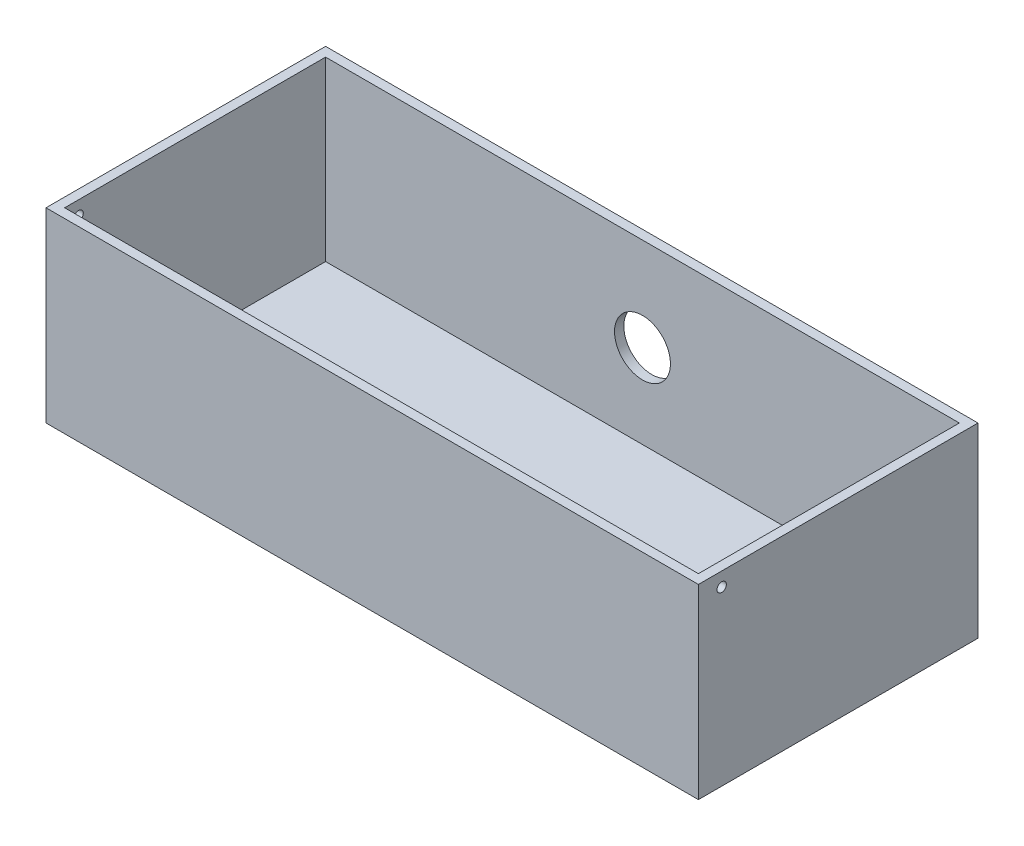
ISO-10303-21;
HEADER;
FILE_DESCRIPTION(('STEP AP214'),'2;1');
FILE_NAME('part.step','',(''),(''),'','','');
FILE_SCHEMA(('AUTOMOTIVE_DESIGN { 1 0 10303 214 1 1 1 1 }'));
ENDSEC;
DATA;
#1=APPLICATION_CONTEXT('core data for automotive mechanical design processes');
#2=APPLICATION_PROTOCOL_DEFINITION('international standard','automotive_design',2000,#1);
#3=PRODUCT_CONTEXT('',#1,'mechanical');
#4=PRODUCT('Part','Part','',(#3));
#5=PRODUCT_RELATED_PRODUCT_CATEGORY('part','',(#4));
#6=PRODUCT_DEFINITION_FORMATION('','',#4);
#7=PRODUCT_DEFINITION_CONTEXT('part definition',#1,'design');
#8=PRODUCT_DEFINITION('design','',#6,#7);
#9=PRODUCT_DEFINITION_SHAPE('','',#8);
#10=(LENGTH_UNIT() NAMED_UNIT(*) SI_UNIT(.MILLI.,.METRE.));
#11=(NAMED_UNIT(*) PLANE_ANGLE_UNIT() SI_UNIT($,.RADIAN.));
#12=(NAMED_UNIT(*) SI_UNIT($,.STERADIAN.) SOLID_ANGLE_UNIT());
#13=UNCERTAINTY_MEASURE_WITH_UNIT(LENGTH_MEASURE(1.E-05),#10,'distance_accuracy_value','');
#14=(GEOMETRIC_REPRESENTATION_CONTEXT(3) GLOBAL_UNCERTAINTY_ASSIGNED_CONTEXT((#13)) GLOBAL_UNIT_ASSIGNED_CONTEXT((#10,
#11,#12)) REPRESENTATION_CONTEXT('',''));
#15=CARTESIAN_POINT('',(0.,0.,0.));
#16=DIRECTION('',(0.,0.,1.));
#17=DIRECTION('',(1.,0.,0.));
#18=AXIS2_PLACEMENT_3D('',#15,#16,#17);
#19=CARTESIAN_POINT('',(350.,200.,150.));
#20=DIRECTION('',(-1.,0.,0.));
#21=DIRECTION('',(0.,0.,1.));
#22=AXIS2_PLACEMENT_3D('',#19,#20,#21);
#23=PLANE('',#22);
#24=CARTESIAN_POINT('',(350.,185.,125.));
#25=DIRECTION('',(1.,0.,0.));
#26=DIRECTION('',(0.,0.,-1.));
#27=AXIS2_PLACEMENT_3D('',#24,#25,#26);
#28=CIRCLE('',#27,4.99999999999999);
#29=CARTESIAN_POINT('',(350.,185.,120.));
#30=VERTEX_POINT('',#29);
#31=EDGE_CURVE('E201',#30,#30,#28,.T.);
#32=ORIENTED_EDGE('',*,*,#31,.F.);
#33=EDGE_LOOP('',(#32));
#34=FACE_BOUND('',#33,.T.);
#35=DIRECTION('',(0.,0.,-1.));
#36=VECTOR('',#35,1.);
#37=CARTESIAN_POINT('',(350.,0.,150.));
#38=LINE('',#37,#36);
#39=CARTESIAN_POINT('',(350.,0.,150.));
#40=VERTEX_POINT('',#39);
#41=CARTESIAN_POINT('',(350.,0.,-150.));
#42=VERTEX_POINT('',#41);
#43=EDGE_CURVE('E145',#40,#42,#38,.T.);
#44=ORIENTED_EDGE('',*,*,#43,.T.);
#45=DIRECTION('',(0.,-1.,0.));
#46=VECTOR('',#45,1.);
#47=CARTESIAN_POINT('',(350.,200.,-150.));
#48=LINE('',#47,#46);
#49=CARTESIAN_POINT('',(350.,200.,-150.));
#50=VERTEX_POINT('',#49);
#51=EDGE_CURVE('E11',#50,#42,#48,.T.);
#52=ORIENTED_EDGE('',*,*,#51,.F.);
#53=DIRECTION('',(0.,0.,-1.));
#54=VECTOR('',#53,1.);
#55=CARTESIAN_POINT('',(350.,200.,150.));
#56=LINE('',#55,#54);
#57=CARTESIAN_POINT('',(350.,200.,150.));
#58=VERTEX_POINT('',#57);
#59=EDGE_CURVE('E149',#58,#50,#56,.T.);
#60=ORIENTED_EDGE('',*,*,#59,.F.);
#61=DIRECTION('',(0.,-1.,0.));
#62=VECTOR('',#61,1.);
#63=CARTESIAN_POINT('',(350.,200.,150.));
#64=LINE('',#63,#62);
#65=EDGE_CURVE('E155',#58,#40,#64,.T.);
#66=ORIENTED_EDGE('',*,*,#65,.T.);
#67=EDGE_LOOP('',(#44,#52,#60,#66));
#68=FACE_BOUND('',#67,.T.);
#69=ADVANCED_FACE('F33',(#34,#68),#23,.F.);
#70=CARTESIAN_POINT('',(-350.,200.,-150.));
#71=DIRECTION('',(0.,0.,1.));
#72=DIRECTION('',(1.,0.,0.));
#73=AXIS2_PLACEMENT_3D('',#70,#71,#72);
#74=PLANE('',#73);
#75=CARTESIAN_POINT('',(0.,100.,-150.));
#76=DIRECTION('',(0.,0.,-1.));
#77=DIRECTION('',(-1.,0.,0.));
#78=AXIS2_PLACEMENT_3D('',#75,#76,#77);
#79=CIRCLE('',#78,30.);
#80=CARTESIAN_POINT('',(-30.,100.,-150.));
#81=VERTEX_POINT('',#80);
#82=EDGE_CURVE('E208',#81,#81,#79,.T.);
#83=ORIENTED_EDGE('',*,*,#82,.F.);
#84=EDGE_LOOP('',(#83));
#85=FACE_BOUND('',#84,.T.);
#86=DIRECTION('',(-1.,0.,0.));
#87=VECTOR('',#86,1.);
#88=CARTESIAN_POINT('',(-350.,0.,-150.));
#89=LINE('',#88,#87);
#90=CARTESIAN_POINT('',(-350.,0.,-150.));
#91=VERTEX_POINT('',#90);
#92=EDGE_CURVE('E158',#42,#91,#89,.T.);
#93=ORIENTED_EDGE('',*,*,#92,.T.);
#94=DIRECTION('',(0.,-1.,0.));
#95=VECTOR('',#94,1.);
#96=CARTESIAN_POINT('',(-350.,200.,-150.));
#97=LINE('',#96,#95);
#98=CARTESIAN_POINT('',(-350.,200.,-150.));
#99=VERTEX_POINT('',#98);
#100=EDGE_CURVE('E41',#99,#91,#97,.T.);
#101=ORIENTED_EDGE('',*,*,#100,.F.);
#102=DIRECTION('',(-1.,0.,0.));
#103=VECTOR('',#102,1.);
#104=CARTESIAN_POINT('',(-350.,200.,-150.));
#105=LINE('',#104,#103);
#106=EDGE_CURVE('E85',#50,#99,#105,.T.);
#107=ORIENTED_EDGE('',*,*,#106,.F.);
#108=ORIENTED_EDGE('',*,*,#51,.T.);
#109=EDGE_LOOP('',(#93,#101,#107,#108));
#110=FACE_BOUND('',#109,.T.);
#111=ADVANCED_FACE('F188',(#85,#110),#74,.F.);
#112=CARTESIAN_POINT('',(-350.,200.,150.));
#113=DIRECTION('',(1.,0.,0.));
#114=DIRECTION('',(0.,0.,-1.));
#115=AXIS2_PLACEMENT_3D('',#112,#113,#114);
#116=PLANE('',#115);
#117=CARTESIAN_POINT('',(-350.,185.,125.));
#118=DIRECTION('',(1.,0.,0.));
#119=DIRECTION('',(0.,0.,-1.));
#120=AXIS2_PLACEMENT_3D('',#117,#118,#119);
#121=CIRCLE('',#120,4.99999999999999);
#122=CARTESIAN_POINT('',(-350.,185.,120.));
#123=VERTEX_POINT('',#122);
#124=EDGE_CURVE('E203',#123,#123,#121,.T.);
#125=ORIENTED_EDGE('',*,*,#124,.T.);
#126=EDGE_LOOP('',(#125));
#127=FACE_BOUND('',#126,.T.);
#128=DIRECTION('',(0.,0.,1.));
#129=VECTOR('',#128,1.);
#130=CARTESIAN_POINT('',(-350.,0.,150.));
#131=LINE('',#130,#129);
#132=CARTESIAN_POINT('',(-350.,0.,150.));
#133=VERTEX_POINT('',#132);
#134=EDGE_CURVE('E160',#91,#133,#131,.T.);
#135=ORIENTED_EDGE('',*,*,#134,.T.);
#136=DIRECTION('',(0.,-1.,0.));
#137=VECTOR('',#136,1.);
#138=CARTESIAN_POINT('',(-350.,200.,150.));
#139=LINE('',#138,#137);
#140=CARTESIAN_POINT('',(-350.,200.,150.));
#141=VERTEX_POINT('',#140);
#142=EDGE_CURVE('E164',#141,#133,#139,.T.);
#143=ORIENTED_EDGE('',*,*,#142,.F.);
#144=DIRECTION('',(0.,0.,1.));
#145=VECTOR('',#144,1.);
#146=CARTESIAN_POINT('',(-350.,200.,150.));
#147=LINE('',#146,#145);
#148=EDGE_CURVE('E152',#99,#141,#147,.T.);
#149=ORIENTED_EDGE('',*,*,#148,.F.);
#150=ORIENTED_EDGE('',*,*,#100,.T.);
#151=EDGE_LOOP('',(#135,#143,#149,#150));
#152=FACE_BOUND('',#151,.T.);
#153=ADVANCED_FACE('F170',(#127,#152),#116,.F.);
#154=CARTESIAN_POINT('',(-350.,200.,150.));
#155=DIRECTION('',(0.,0.,-1.));
#156=DIRECTION('',(-1.,0.,0.));
#157=AXIS2_PLACEMENT_3D('',#154,#155,#156);
#158=PLANE('',#157);
#159=DIRECTION('',(1.,0.,0.));
#160=VECTOR('',#159,1.);
#161=CARTESIAN_POINT('',(-350.,0.,150.));
#162=LINE('',#161,#160);
#163=EDGE_CURVE('E78',#133,#40,#162,.T.);
#164=ORIENTED_EDGE('',*,*,#163,.T.);
#165=ORIENTED_EDGE('',*,*,#65,.F.);
#166=DIRECTION('',(1.,0.,0.));
#167=VECTOR('',#166,1.);
#168=CARTESIAN_POINT('',(-350.,200.,150.));
#169=LINE('',#168,#167);
#170=EDGE_CURVE('E57',#141,#58,#169,.T.);
#171=ORIENTED_EDGE('',*,*,#170,.F.);
#172=ORIENTED_EDGE('',*,*,#142,.T.);
#173=EDGE_LOOP('',(#164,#165,#171,#172));
#174=FACE_BOUND('',#173,.T.);
#175=ADVANCED_FACE('F178',(#174),#158,.F.);
#176=CARTESIAN_POINT('',(0.,200.,0.));
#177=DIRECTION('',(0.,-1.,0.));
#178=DIRECTION('',(0.,0.,-1.));
#179=AXIS2_PLACEMENT_3D('',#176,#177,#178);
#180=PLANE('',#179);
#181=DIRECTION('',(-1.,0.,0.));
#182=VECTOR('',#181,1.);
#183=CARTESIAN_POINT('',(-340.,200.,-140.));
#184=LINE('',#183,#182);
#185=CARTESIAN_POINT('',(340.,200.,-140.));
#186=VERTEX_POINT('',#185);
#187=CARTESIAN_POINT('',(-340.,200.,-140.));
#188=VERTEX_POINT('',#187);
#189=EDGE_CURVE('E139',#186,#188,#184,.T.);
#190=ORIENTED_EDGE('',*,*,#189,.F.);
#191=DIRECTION('',(0.,0.,-1.));
#192=VECTOR('',#191,1.);
#193=CARTESIAN_POINT('',(340.,200.,140.));
#194=LINE('',#193,#192);
#195=CARTESIAN_POINT('',(340.,200.,140.));
#196=VERTEX_POINT('',#195);
#197=EDGE_CURVE('E48',#196,#186,#194,.T.);
#198=ORIENTED_EDGE('',*,*,#197,.F.);
#199=DIRECTION('',(1.,0.,0.));
#200=VECTOR('',#199,1.);
#201=CARTESIAN_POINT('',(-340.,200.,140.));
#202=LINE('',#201,#200);
#203=CARTESIAN_POINT('',(-340.,200.,140.));
#204=VERTEX_POINT('',#203);
#205=EDGE_CURVE('E127',#204,#196,#202,.T.);
#206=ORIENTED_EDGE('',*,*,#205,.F.);
#207=DIRECTION('',(0.,0.,1.));
#208=VECTOR('',#207,1.);
#209=CARTESIAN_POINT('',(-340.,200.,140.));
#210=LINE('',#209,#208);
#211=EDGE_CURVE('E130',#188,#204,#210,.T.);
#212=ORIENTED_EDGE('',*,*,#211,.F.);
#213=EDGE_LOOP('',(#190,#198,#206,#212));
#214=FACE_BOUND('',#213,.T.);
#215=ORIENTED_EDGE('',*,*,#59,.T.);
#216=ORIENTED_EDGE('',*,*,#106,.T.);
#217=ORIENTED_EDGE('',*,*,#148,.T.);
#218=ORIENTED_EDGE('',*,*,#170,.T.);
#219=EDGE_LOOP('',(#215,#216,#217,#218));
#220=FACE_BOUND('',#219,.T.);
#221=ADVANCED_FACE('F180',(#214,#220),#180,.F.);
#222=CARTESIAN_POINT('',(0.,0.,0.));
#223=DIRECTION('',(0.,-1.,0.));
#224=DIRECTION('',(0.,0.,-1.));
#225=AXIS2_PLACEMENT_3D('',#222,#223,#224);
#226=PLANE('',#225);
#227=ORIENTED_EDGE('',*,*,#43,.F.);
#228=ORIENTED_EDGE('',*,*,#163,.F.);
#229=ORIENTED_EDGE('',*,*,#134,.F.);
#230=ORIENTED_EDGE('',*,*,#92,.F.);
#231=EDGE_LOOP('',(#227,#228,#229,#230));
#232=FACE_BOUND('',#231,.T.);
#233=ADVANCED_FACE('F174',(#232),#226,.T.);
#234=CARTESIAN_POINT('',(340.,10.,140.));
#235=DIRECTION('',(1.,0.,0.));
#236=DIRECTION('',(0.,0.,-1.));
#237=AXIS2_PLACEMENT_3D('',#234,#235,#236);
#238=PLANE('',#237);
#239=CARTESIAN_POINT('',(340.,185.,125.));
#240=DIRECTION('',(1.,0.,0.));
#241=DIRECTION('',(0.,0.,-1.));
#242=AXIS2_PLACEMENT_3D('',#239,#240,#241);
#243=CIRCLE('',#242,4.99999999999999);
#244=CARTESIAN_POINT('',(340.,185.,120.));
#245=VERTEX_POINT('',#244);
#246=EDGE_CURVE('E133',#245,#245,#243,.T.);
#247=ORIENTED_EDGE('',*,*,#246,.T.);
#248=EDGE_LOOP('',(#247));
#249=FACE_BOUND('',#248,.T.);
#250=ORIENTED_EDGE('',*,*,#197,.T.);
#251=DIRECTION('',(0.,1.,0.));
#252=VECTOR('',#251,1.);
#253=CARTESIAN_POINT('',(340.,10.,-140.));
#254=LINE('',#253,#252);
#255=CARTESIAN_POINT('',(340.,10.,-140.));
#256=VERTEX_POINT('',#255);
#257=EDGE_CURVE('E105',#256,#186,#254,.T.);
#258=ORIENTED_EDGE('',*,*,#257,.F.);
#259=DIRECTION('',(0.,0.,-1.));
#260=VECTOR('',#259,1.);
#261=CARTESIAN_POINT('',(340.,10.,140.));
#262=LINE('',#261,#260);
#263=CARTESIAN_POINT('',(340.,10.,140.));
#264=VERTEX_POINT('',#263);
#265=EDGE_CURVE('E109',#264,#256,#262,.T.);
#266=ORIENTED_EDGE('',*,*,#265,.F.);
#267=DIRECTION('',(0.,1.,0.));
#268=VECTOR('',#267,1.);
#269=CARTESIAN_POINT('',(340.,10.,140.));
#270=LINE('',#269,#268);
#271=EDGE_CURVE('E143',#264,#196,#270,.T.);
#272=ORIENTED_EDGE('',*,*,#271,.T.);
#273=EDGE_LOOP('',(#250,#258,#266,#272));
#274=FACE_BOUND('',#273,.T.);
#275=ADVANCED_FACE('F107',(#249,#274),#238,.F.);
#276=CARTESIAN_POINT('',(-340.,10.,140.));
#277=DIRECTION('',(0.,0.,1.));
#278=DIRECTION('',(1.,0.,0.));
#279=AXIS2_PLACEMENT_3D('',#276,#277,#278);
#280=PLANE('',#279);
#281=ORIENTED_EDGE('',*,*,#205,.T.);
#282=ORIENTED_EDGE('',*,*,#271,.F.);
#283=DIRECTION('',(1.,0.,0.));
#284=VECTOR('',#283,1.);
#285=CARTESIAN_POINT('',(-340.,10.,140.));
#286=LINE('',#285,#284);
#287=CARTESIAN_POINT('',(-340.,10.,140.));
#288=VERTEX_POINT('',#287);
#289=EDGE_CURVE('E115',#288,#264,#286,.T.);
#290=ORIENTED_EDGE('',*,*,#289,.F.);
#291=DIRECTION('',(0.,1.,0.));
#292=VECTOR('',#291,1.);
#293=CARTESIAN_POINT('',(-340.,10.,140.));
#294=LINE('',#293,#292);
#295=EDGE_CURVE('E146',#288,#204,#294,.T.);
#296=ORIENTED_EDGE('',*,*,#295,.T.);
#297=EDGE_LOOP('',(#281,#282,#290,#296));
#298=FACE_BOUND('',#297,.T.);
#299=ADVANCED_FACE('F227',(#298),#280,.F.);
#300=CARTESIAN_POINT('',(-340.,10.,140.));
#301=DIRECTION('',(-1.,0.,0.));
#302=DIRECTION('',(0.,0.,1.));
#303=AXIS2_PLACEMENT_3D('',#300,#301,#302);
#304=PLANE('',#303);
#305=CARTESIAN_POINT('',(-340.,185.,125.));
#306=DIRECTION('',(-1.,0.,0.));
#307=DIRECTION('',(0.,0.,1.));
#308=AXIS2_PLACEMENT_3D('',#305,#306,#307);
#309=CIRCLE('',#308,4.99999999999999);
#310=CARTESIAN_POINT('',(-340.,185.,130.));
#311=VERTEX_POINT('',#310);
#312=EDGE_CURVE('E36',#311,#311,#309,.T.);
#313=ORIENTED_EDGE('',*,*,#312,.T.);
#314=EDGE_LOOP('',(#313));
#315=FACE_BOUND('',#314,.T.);
#316=ORIENTED_EDGE('',*,*,#211,.T.);
#317=ORIENTED_EDGE('',*,*,#295,.F.);
#318=DIRECTION('',(0.,0.,1.));
#319=VECTOR('',#318,1.);
#320=CARTESIAN_POINT('',(-340.,10.,140.));
#321=LINE('',#320,#319);
#322=CARTESIAN_POINT('',(-340.,10.,-140.));
#323=VERTEX_POINT('',#322);
#324=EDGE_CURVE('E123',#323,#288,#321,.T.);
#325=ORIENTED_EDGE('',*,*,#324,.F.);
#326=DIRECTION('',(0.,1.,0.));
#327=VECTOR('',#326,1.);
#328=CARTESIAN_POINT('',(-340.,10.,-140.));
#329=LINE('',#328,#327);
#330=EDGE_CURVE('E114',#323,#188,#329,.T.);
#331=ORIENTED_EDGE('',*,*,#330,.T.);
#332=EDGE_LOOP('',(#316,#317,#325,#331));
#333=FACE_BOUND('',#332,.T.);
#334=ADVANCED_FACE('F230',(#315,#333),#304,.F.);
#335=CARTESIAN_POINT('',(-340.,10.,-140.));
#336=DIRECTION('',(0.,0.,-1.));
#337=DIRECTION('',(-1.,0.,0.));
#338=AXIS2_PLACEMENT_3D('',#335,#336,#337);
#339=PLANE('',#338);
#340=CARTESIAN_POINT('',(0.,100.,-140.));
#341=DIRECTION('',(0.,0.,-1.));
#342=DIRECTION('',(-1.,0.,0.));
#343=AXIS2_PLACEMENT_3D('',#340,#341,#342);
#344=CIRCLE('',#343,30.);
#345=CARTESIAN_POINT('',(-30.,100.,-140.));
#346=VERTEX_POINT('',#345);
#347=EDGE_CURVE('E204',#346,#346,#344,.F.);
#348=ORIENTED_EDGE('',*,*,#347,.F.);
#349=EDGE_LOOP('',(#348));
#350=FACE_BOUND('',#349,.T.);
#351=ORIENTED_EDGE('',*,*,#189,.T.);
#352=ORIENTED_EDGE('',*,*,#330,.F.);
#353=DIRECTION('',(-1.,0.,0.));
#354=VECTOR('',#353,1.);
#355=CARTESIAN_POINT('',(-340.,10.,-140.));
#356=LINE('',#355,#354);
#357=EDGE_CURVE('E118',#256,#323,#356,.T.);
#358=ORIENTED_EDGE('',*,*,#357,.F.);
#359=ORIENTED_EDGE('',*,*,#257,.T.);
#360=EDGE_LOOP('',(#351,#352,#358,#359));
#361=FACE_BOUND('',#360,.T.);
#362=ADVANCED_FACE('F119',(#350,#361),#339,.F.);
#363=CARTESIAN_POINT('',(0.,10.,0.));
#364=DIRECTION('',(0.,-1.,0.));
#365=DIRECTION('',(0.,0.,-1.));
#366=AXIS2_PLACEMENT_3D('',#363,#364,#365);
#367=PLANE('',#366);
#368=ORIENTED_EDGE('',*,*,#265,.T.);
#369=ORIENTED_EDGE('',*,*,#357,.T.);
#370=ORIENTED_EDGE('',*,*,#324,.T.);
#371=ORIENTED_EDGE('',*,*,#289,.T.);
#372=EDGE_LOOP('',(#368,#369,#370,#371));
#373=FACE_BOUND('',#372,.T.);
#374=ADVANCED_FACE('F125',(#373),#367,.F.);
#375=CARTESIAN_POINT('',(-350.,185.,125.));
#376=DIRECTION('',(1.,0.,0.));
#377=DIRECTION('',(0.,0.,-1.));
#378=AXIS2_PLACEMENT_3D('',#375,#376,#377);
#379=CYLINDRICAL_SURFACE('',#378,4.99999999999999);
#380=ORIENTED_EDGE('',*,*,#124,.F.);
#381=EDGE_LOOP('',(#380));
#382=FACE_BOUND('',#381,.T.);
#383=ORIENTED_EDGE('',*,*,#312,.F.);
#384=EDGE_LOOP('',(#383));
#385=FACE_BOUND('',#384,.T.);
#386=ADVANCED_FACE('F222',(#382,#385),#379,.F.);
#387=ORIENTED_EDGE('',*,*,#31,.T.);
#388=EDGE_LOOP('',(#387));
#389=FACE_BOUND('',#388,.T.);
#390=ORIENTED_EDGE('',*,*,#246,.F.);
#391=EDGE_LOOP('',(#390));
#392=FACE_BOUND('',#391,.T.);
#393=ADVANCED_FACE('F216',(#389,#392),#379,.F.);
#394=CARTESIAN_POINT('',(0.,100.,-55.1471862576143));
#395=DIRECTION('',(0.,0.,-1.));
#396=DIRECTION('',(-1.,0.,0.));
#397=AXIS2_PLACEMENT_3D('',#394,#395,#396);
#398=CYLINDRICAL_SURFACE('',#397,30.);
#399=CARTESIAN_POINT('',(-30.,100.,-140.));
#400=CARTESIAN_POINT('',(-30.,100.,-140.104166666667));
#401=CARTESIAN_POINT('',(-30.,100.,-140.208333333333));
#402=CARTESIAN_POINT('',(-30.,100.,-140.416666666667));
#403=CARTESIAN_POINT('',(-30.,100.,-140.520833333333));
#404=CARTESIAN_POINT('',(-30.,100.,-140.729166666667));
#405=CARTESIAN_POINT('',(-30.,100.,-140.833333333333));
#406=CARTESIAN_POINT('',(-30.,100.,-141.041666666667));
#407=CARTESIAN_POINT('',(-30.,100.,-141.145833333333));
#408=CARTESIAN_POINT('',(-30.,100.,-141.354166666667));
#409=CARTESIAN_POINT('',(-30.,100.,-141.458333333333));
#410=CARTESIAN_POINT('',(-30.,100.,-141.666666666667));
#411=CARTESIAN_POINT('',(-30.,100.,-141.770833333333));
#412=CARTESIAN_POINT('',(-30.,100.,-141.979166666667));
#413=CARTESIAN_POINT('',(-30.,100.,-142.083333333333));
#414=CARTESIAN_POINT('',(-30.,100.,-142.291666666667));
#415=CARTESIAN_POINT('',(-30.,100.,-142.395833333333));
#416=CARTESIAN_POINT('',(-30.,100.,-142.604166666667));
#417=CARTESIAN_POINT('',(-30.,100.,-142.708333333333));
#418=CARTESIAN_POINT('',(-30.,100.,-142.916666666667));
#419=CARTESIAN_POINT('',(-30.,100.,-143.020833333333));
#420=CARTESIAN_POINT('',(-30.,100.,-143.229166666667));
#421=CARTESIAN_POINT('',(-30.,100.,-143.333333333333));
#422=CARTESIAN_POINT('',(-30.,100.,-143.541666666667));
#423=CARTESIAN_POINT('',(-30.,100.,-143.645833333333));
#424=CARTESIAN_POINT('',(-30.,100.,-143.854166666667));
#425=CARTESIAN_POINT('',(-30.,100.,-143.958333333333));
#426=CARTESIAN_POINT('',(-30.,100.,-144.166666666667));
#427=CARTESIAN_POINT('',(-30.,100.,-144.270833333333));
#428=CARTESIAN_POINT('',(-30.,100.,-144.479166666667));
#429=CARTESIAN_POINT('',(-30.,100.,-144.583333333333));
#430=CARTESIAN_POINT('',(-30.,100.,-144.791666666667));
#431=CARTESIAN_POINT('',(-30.,100.,-144.895833333333));
#432=CARTESIAN_POINT('',(-30.,100.,-145.104166666667));
#433=CARTESIAN_POINT('',(-30.,100.,-145.208333333333));
#434=CARTESIAN_POINT('',(-30.,100.,-145.416666666667));
#435=CARTESIAN_POINT('',(-30.,100.,-145.520833333333));
#436=CARTESIAN_POINT('',(-30.,100.,-145.729166666667));
#437=CARTESIAN_POINT('',(-30.,100.,-145.833333333333));
#438=CARTESIAN_POINT('',(-30.,100.,-146.041666666667));
#439=CARTESIAN_POINT('',(-30.,100.,-146.145833333333));
#440=CARTESIAN_POINT('',(-30.,100.,-146.354166666667));
#441=CARTESIAN_POINT('',(-30.,100.,-146.458333333333));
#442=CARTESIAN_POINT('',(-30.,100.,-146.666666666667));
#443=CARTESIAN_POINT('',(-30.,100.,-146.770833333333));
#444=CARTESIAN_POINT('',(-30.,100.,-146.979166666667));
#445=CARTESIAN_POINT('',(-30.,100.,-147.083333333333));
#446=CARTESIAN_POINT('',(-30.,100.,-147.291666666667));
#447=CARTESIAN_POINT('',(-30.,100.,-147.395833333333));
#448=CARTESIAN_POINT('',(-30.,100.,-147.604166666667));
#449=CARTESIAN_POINT('',(-30.,100.,-147.708333333333));
#450=CARTESIAN_POINT('',(-30.,100.,-147.916666666667));
#451=CARTESIAN_POINT('',(-30.,100.,-148.020833333333));
#452=CARTESIAN_POINT('',(-30.,100.,-148.229166666667));
#453=CARTESIAN_POINT('',(-30.,100.,-148.333333333333));
#454=CARTESIAN_POINT('',(-30.,100.,-148.541666666667));
#455=CARTESIAN_POINT('',(-30.,100.,-148.645833333333));
#456=CARTESIAN_POINT('',(-30.,100.,-148.854166666667));
#457=CARTESIAN_POINT('',(-30.,100.,-148.958333333333));
#458=CARTESIAN_POINT('',(-30.,100.,-149.166666666667));
#459=CARTESIAN_POINT('',(-30.,100.,-149.270833333333));
#460=CARTESIAN_POINT('',(-30.,100.,-149.479166666667));
#461=CARTESIAN_POINT('',(-30.,100.,-149.583333333333));
#462=CARTESIAN_POINT('',(-30.,100.,-149.791666666667));
#463=CARTESIAN_POINT('',(-30.,100.,-149.895833333333));
#464=CARTESIAN_POINT('',(-30.,100.,-150.));
#465=B_SPLINE_CURVE_WITH_KNOTS('',3,(#399,#400,#401,#402,#403,#404,#405,#406,#407,#408,#409,
#410,#411,#412,#413,#414,#415,#416,#417,#418,#419,#420,#421,#422,#423,#424,#425,#426,#427,#428,
#429,#430,#431,#432,#433,#434,#435,#436,#437,#438,#439,#440,#441,#442,#443,#444,#445,#446,#447,
#448,#449,#450,#451,#452,#453,#454,#455,#456,#457,#458,#459,#460,#461,#462,#463,#464),
.UNSPECIFIED.,.F.,.F.,(4,2,2,2,2,2,2,2,2,2,2,2,2,2,2,2,2,2,2,2,2,2,2,2,2,2,2,2,2,2,2,2,4),(0.,
0.312499999999993,0.625000000000014,0.937500000000008,1.25000000000003,1.56250000000002,
1.87500000000002,2.18750000000001,2.5,2.8125,3.12499999999999,3.43749999999998,3.74999999999998,
4.0625,4.37499999999999,4.68750000000001,5.,5.3125,5.62499999999999,5.93749999999998,
6.24999999999998,6.56249999999997,6.87499999999996,7.18749999999999,7.49999999999998,
7.81249999999997,8.12499999999999,8.43749999999999,8.74999999999998,9.06249999999997,
9.37499999999997,9.68749999999996,9.99999999999995),.UNSPECIFIED.);
#466=EDGE_CURVE('BSEAM214',#346,#81,#465,.T.);
#467=ORIENTED_EDGE('',*,*,#347,.T.);
#468=ORIENTED_EDGE('',*,*,#82,.T.);
#469=ORIENTED_EDGE('',*,*,#466,.T.);
#470=ORIENTED_EDGE('',*,*,#466,.F.);
#471=EDGE_LOOP('',(#467,#469,#468,#470));
#472=FACE_BOUND('',#471,.T.);
#473=ADVANCED_FACE('F214',(#472),#398,.F.);
#474=CLOSED_SHELL('',(#69,#111,#153,#175,#221,#233,#275,#299,#334,#362,#374,#386,#393,#473));
#475=MANIFOLD_SOLID_BREP('B2',#474);
#476=ADVANCED_BREP_SHAPE_REPRESENTATION('',(#18,#475),#14);
#477=SHAPE_DEFINITION_REPRESENTATION(#9,#476);
ENDSEC;
END-ISO-10303-21;
